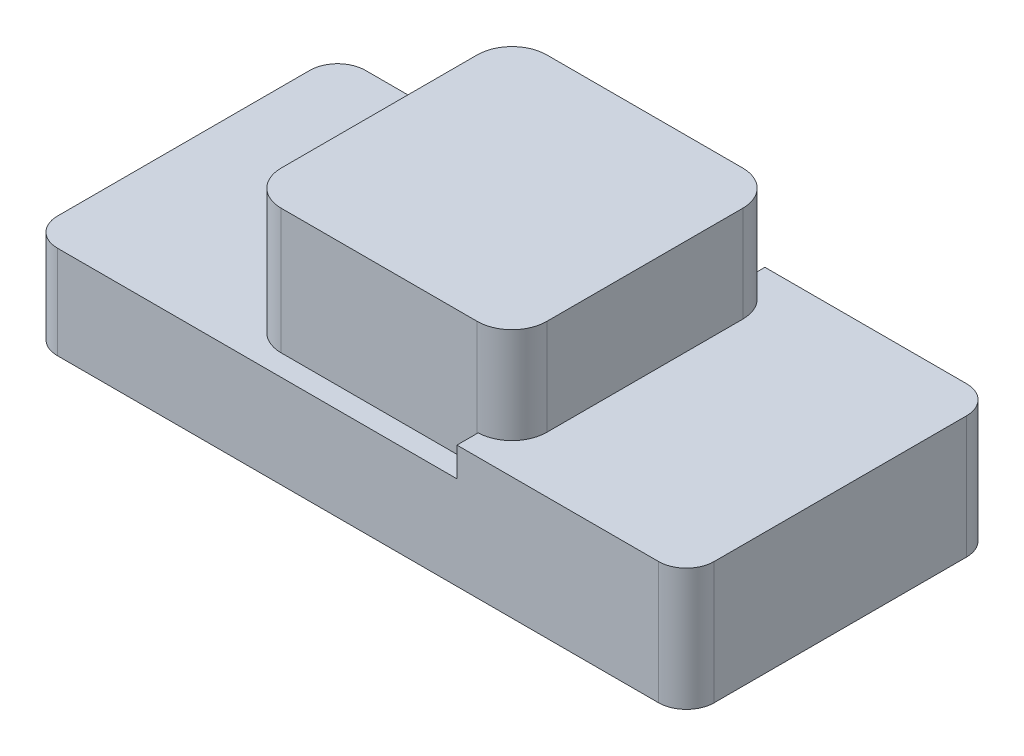
ISO-10303-21;
HEADER;
FILE_DESCRIPTION(('STEP AP214'),'2;1');
FILE_NAME('part.step','',(''),(''),'','','');
FILE_SCHEMA(('AUTOMOTIVE_DESIGN { 1 0 10303 214 1 1 1 1 }'));
ENDSEC;
DATA;
#1=APPLICATION_CONTEXT('core data for automotive mechanical design processes');
#2=APPLICATION_PROTOCOL_DEFINITION('international standard','automotive_design',2000,#1);
#3=PRODUCT_CONTEXT('',#1,'mechanical');
#4=PRODUCT('Part','Part','',(#3));
#5=PRODUCT_RELATED_PRODUCT_CATEGORY('part','',(#4));
#6=PRODUCT_DEFINITION_FORMATION('','',#4);
#7=PRODUCT_DEFINITION_CONTEXT('part definition',#1,'design');
#8=PRODUCT_DEFINITION('design','',#6,#7);
#9=PRODUCT_DEFINITION_SHAPE('','',#8);
#10=(LENGTH_UNIT() NAMED_UNIT(*) SI_UNIT(.MILLI.,.METRE.));
#11=(NAMED_UNIT(*) PLANE_ANGLE_UNIT() SI_UNIT($,.RADIAN.));
#12=(NAMED_UNIT(*) SI_UNIT($,.STERADIAN.) SOLID_ANGLE_UNIT());
#13=UNCERTAINTY_MEASURE_WITH_UNIT(LENGTH_MEASURE(1.E-05),#10,'distance_accuracy_value','');
#14=(GEOMETRIC_REPRESENTATION_CONTEXT(3) GLOBAL_UNCERTAINTY_ASSIGNED_CONTEXT((#13)) GLOBAL_UNIT_ASSIGNED_CONTEXT((#10,
#11,#12)) REPRESENTATION_CONTEXT('',''));
#15=CARTESIAN_POINT('',(0.,0.,0.));
#16=DIRECTION('',(0.,0.,1.));
#17=DIRECTION('',(1.,0.,0.));
#18=AXIS2_PLACEMENT_3D('',#15,#16,#17);
#19=CARTESIAN_POINT('',(-16.3982852416057,17.6,44.3));
#20=DIRECTION('',(0.,-1.,0.));
#21=DIRECTION('',(0.,0.,-1.));
#22=AXIS2_PLACEMENT_3D('',#19,#20,#21);
#23=PLANE('',#22);
#24=DIRECTION('',(0.,0.,-1.));
#25=VECTOR('',#24,1.);
#26=CARTESIAN_POINT('',(16.6017147583943,17.6,44.3));
#27=LINE('',#26,#25);
#28=CARTESIAN_POINT('',(16.6017147583943,17.6,40.3));
#29=VERTEX_POINT('',#28);
#30=CARTESIAN_POINT('',(16.6017147583943,17.6,4.));
#31=VERTEX_POINT('',#30);
#32=EDGE_CURVE('E200',#29,#31,#27,.T.);
#33=ORIENTED_EDGE('',*,*,#32,.T.);
#34=CARTESIAN_POINT('',(12.6017147583943,17.6,4.));
#35=DIRECTION('',(0.,-1.,0.));
#36=DIRECTION('',(0.,0.,-1.));
#37=AXIS2_PLACEMENT_3D('',#34,#35,#36);
#38=CIRCLE('',#37,4.);
#39=CARTESIAN_POINT('',(12.6017147583943,17.6,0.));
#40=VERTEX_POINT('',#39);
#41=EDGE_CURVE('E64',#31,#40,#38,.F.);
#42=ORIENTED_EDGE('',*,*,#41,.T.);
#43=DIRECTION('',(-1.,0.,0.));
#44=VECTOR('',#43,1.);
#45=CARTESIAN_POINT('',(-16.3982852416057,17.6,0.));
#46=LINE('',#45,#44);
#47=CARTESIAN_POINT('',(-16.3982852416057,17.6,0.));
#48=VERTEX_POINT('',#47);
#49=EDGE_CURVE('E214',#40,#48,#46,.T.);
#50=ORIENTED_EDGE('',*,*,#49,.T.);
#51=DIRECTION('',(0.,0.,-1.));
#52=VECTOR('',#51,1.);
#53=CARTESIAN_POINT('',(-16.3982852416057,17.6,44.3));
#54=LINE('',#53,#52);
#55=CARTESIAN_POINT('',(-16.3982852416057,17.6,3.05169028570657));
#56=VERTEX_POINT('',#55);
#57=EDGE_CURVE('E201',#56,#48,#54,.T.);
#58=ORIENTED_EDGE('',*,*,#57,.F.);
#59=CARTESIAN_POINT('',(-16.5282852416057,17.6,8.05));
#60=DIRECTION('',(0.,-1.,0.));
#61=DIRECTION('',(0.,0.,-1.));
#62=AXIS2_PLACEMENT_3D('',#59,#60,#61);
#63=CIRCLE('',#62,5.);
#64=CARTESIAN_POINT('',(-11.5282852416057,17.6,8.05));
#65=VERTEX_POINT('',#64);
#66=EDGE_CURVE('E305',#56,#65,#63,.T.);
#67=ORIENTED_EDGE('',*,*,#66,.T.);
#68=DIRECTION('',(0.,0.,-1.));
#69=VECTOR('',#68,1.);
#70=CARTESIAN_POINT('',(-11.5282852416056,17.6,44.3));
#71=LINE('',#70,#69);
#72=CARTESIAN_POINT('',(-11.5282852416056,17.6,36.25));
#73=VERTEX_POINT('',#72);
#74=EDGE_CURVE('E250',#73,#65,#71,.T.);
#75=ORIENTED_EDGE('',*,*,#74,.F.);
#76=CARTESIAN_POINT('',(-16.5282852416056,17.6,36.25));
#77=DIRECTION('',(0.,-1.,0.));
#78=DIRECTION('',(0.,0.,-1.));
#79=AXIS2_PLACEMENT_3D('',#76,#77,#78);
#80=CIRCLE('',#79,5.);
#81=CARTESIAN_POINT('',(-16.3982852416057,17.6,41.2483097142934));
#82=VERTEX_POINT('',#81);
#83=EDGE_CURVE('E195',#73,#82,#80,.T.);
#84=ORIENTED_EDGE('',*,*,#83,.T.);
#85=CARTESIAN_POINT('',(-16.3982852416057,17.6,44.3));
#86=VERTEX_POINT('',#85);
#87=EDGE_CURVE('E192',#86,#82,#54,.T.);
#88=ORIENTED_EDGE('',*,*,#87,.F.);
#89=DIRECTION('',(-1.,0.,0.));
#90=VECTOR('',#89,1.);
#91=CARTESIAN_POINT('',(-16.3982852416057,17.6,44.3));
#92=LINE('',#91,#90);
#93=CARTESIAN_POINT('',(12.6017147583943,17.6,44.3));
#94=VERTEX_POINT('',#93);
#95=EDGE_CURVE('E179',#94,#86,#92,.T.);
#96=ORIENTED_EDGE('',*,*,#95,.F.);
#97=CARTESIAN_POINT('',(12.6017147583943,17.6,40.3));
#98=DIRECTION('',(0.,-1.,0.));
#99=DIRECTION('',(0.,0.,-1.));
#100=AXIS2_PLACEMENT_3D('',#97,#98,#99);
#101=CIRCLE('',#100,4.);
#102=EDGE_CURVE('E57',#94,#29,#101,.F.);
#103=ORIENTED_EDGE('',*,*,#102,.T.);
#104=EDGE_LOOP('',(#33,#42,#50,#58,#67,#75,#84,#88,#96,#103));
#105=FACE_BOUND('',#104,.T.);
#106=ADVANCED_FACE('F41',(#105),#23,.F.);
#107=CARTESIAN_POINT('',(-16.3982852416057,13.4,44.3));
#108=DIRECTION('',(1.,0.,0.));
#109=DIRECTION('',(0.,0.,-1.));
#110=AXIS2_PLACEMENT_3D('',#107,#108,#109);
#111=PLANE('',#110);
#112=ORIENTED_EDGE('',*,*,#87,.T.);
#113=DIRECTION('',(0.,-1.,0.));
#114=VECTOR('',#113,1.);
#115=CARTESIAN_POINT('',(-16.3982852416057,17.6,41.2483097142934));
#116=LINE('',#115,#114);
#117=CARTESIAN_POINT('',(-16.3982852416057,13.4,41.2483097142934));
#118=VERTEX_POINT('',#117);
#119=EDGE_CURVE('E310',#82,#118,#116,.T.);
#120=ORIENTED_EDGE('',*,*,#119,.T.);
#121=DIRECTION('',(0.,0.,-1.));
#122=VECTOR('',#121,1.);
#123=CARTESIAN_POINT('',(-16.3982852416057,13.4,44.3));
#124=LINE('',#123,#122);
#125=CARTESIAN_POINT('',(-16.3982852416057,13.4,44.3));
#126=VERTEX_POINT('',#125);
#127=EDGE_CURVE('E204',#126,#118,#124,.T.);
#128=ORIENTED_EDGE('',*,*,#127,.F.);
#129=DIRECTION('',(0.,-1.,0.));
#130=VECTOR('',#129,1.);
#131=CARTESIAN_POINT('',(-16.3982852416057,13.4,44.3));
#132=LINE('',#131,#130);
#133=EDGE_CURVE('E185',#86,#126,#132,.T.);
#134=ORIENTED_EDGE('',*,*,#133,.F.);
#135=EDGE_LOOP('',(#112,#120,#128,#134));
#136=FACE_BOUND('',#135,.T.);
#137=ADVANCED_FACE('F203',(#136),#111,.F.);
#138=CARTESIAN_POINT('',(-16.3982852416057,13.4,3.05169028570657));
#139=VERTEX_POINT('',#138);
#140=CARTESIAN_POINT('',(-16.3982852416057,13.4,0.));
#141=VERTEX_POINT('',#140);
#142=EDGE_CURVE('E237',#139,#141,#124,.T.);
#143=ORIENTED_EDGE('',*,*,#142,.F.);
#144=DIRECTION('',(0.,-1.,0.));
#145=VECTOR('',#144,1.);
#146=CARTESIAN_POINT('',(-16.3982852416057,13.4,3.05169028570657));
#147=LINE('',#146,#145);
#148=EDGE_CURVE('E301',#139,#56,#147,.F.);
#149=ORIENTED_EDGE('',*,*,#148,.T.);
#150=ORIENTED_EDGE('',*,*,#57,.T.);
#151=DIRECTION('',(0.,-1.,0.));
#152=VECTOR('',#151,1.);
#153=CARTESIAN_POINT('',(-16.3982852416057,13.4,0.));
#154=LINE('',#153,#152);
#155=EDGE_CURVE('E217',#48,#141,#154,.T.);
#156=ORIENTED_EDGE('',*,*,#155,.T.);
#157=EDGE_LOOP('',(#143,#149,#150,#156));
#158=FACE_BOUND('',#157,.T.);
#159=ADVANCED_FACE('F438',(#158),#111,.F.);
#160=CARTESIAN_POINT('',(-16.3982852416057,13.4,44.3));
#161=DIRECTION('',(0.,-1.,0.));
#162=DIRECTION('',(0.,0.,-1.));
#163=AXIS2_PLACEMENT_3D('',#160,#161,#162);
#164=PLANE('',#163);
#165=DIRECTION('',(-1.,0.,0.));
#166=VECTOR('',#165,1.);
#167=CARTESIAN_POINT('',(-16.3982852416057,13.4,0.));
#168=LINE('',#167,#166);
#169=CARTESIAN_POINT('',(-73.8582852416056,13.4,0.));
#170=VERTEX_POINT('',#169);
#171=EDGE_CURVE('E222',#141,#170,#168,.T.);
#172=ORIENTED_EDGE('',*,*,#171,.T.);
#173=CARTESIAN_POINT('',(-73.8582852416056,13.4,4.));
#174=DIRECTION('',(0.,-1.,0.));
#175=DIRECTION('',(0.,0.,-1.));
#176=AXIS2_PLACEMENT_3D('',#173,#174,#175);
#177=CIRCLE('',#176,4.);
#178=CARTESIAN_POINT('',(-77.8582852416057,13.4,4.));
#179=VERTEX_POINT('',#178);
#180=EDGE_CURVE('E347',#170,#179,#177,.F.);
#181=ORIENTED_EDGE('',*,*,#180,.T.);
#182=DIRECTION('',(0.,0.,-1.));
#183=VECTOR('',#182,1.);
#184=CARTESIAN_POINT('',(-77.8582852416057,13.4,44.3));
#185=LINE('',#184,#183);
#186=CARTESIAN_POINT('',(-77.8582852416057,13.4,40.3));
#187=VERTEX_POINT('',#186);
#188=EDGE_CURVE('E233',#187,#179,#185,.T.);
#189=ORIENTED_EDGE('',*,*,#188,.F.);
#190=CARTESIAN_POINT('',(-73.8582852416056,13.4,40.3));
#191=DIRECTION('',(0.,-1.,0.));
#192=DIRECTION('',(0.,0.,-1.));
#193=AXIS2_PLACEMENT_3D('',#190,#191,#192);
#194=CIRCLE('',#193,4.);
#195=CARTESIAN_POINT('',(-73.8582852416056,13.4,44.3));
#196=VERTEX_POINT('',#195);
#197=EDGE_CURVE('E344',#187,#196,#194,.F.);
#198=ORIENTED_EDGE('',*,*,#197,.T.);
#199=DIRECTION('',(-1.,0.,0.));
#200=VECTOR('',#199,1.);
#201=CARTESIAN_POINT('',(-16.3982852416057,13.4,44.3));
#202=LINE('',#201,#200);
#203=EDGE_CURVE('E207',#126,#196,#202,.T.);
#204=ORIENTED_EDGE('',*,*,#203,.F.);
#205=ORIENTED_EDGE('',*,*,#127,.T.);
#206=CARTESIAN_POINT('',(-16.5282852416056,13.4,36.25));
#207=DIRECTION('',(0.,-1.,0.));
#208=DIRECTION('',(0.,0.,-1.));
#209=AXIS2_PLACEMENT_3D('',#206,#207,#208);
#210=CIRCLE('',#209,5.);
#211=CARTESIAN_POINT('',(-16.5282852416056,13.4,41.25));
#212=VERTEX_POINT('',#211);
#213=EDGE_CURVE('E313',#118,#212,#210,.T.);
#214=ORIENTED_EDGE('',*,*,#213,.T.);
#215=DIRECTION('',(1.,0.,0.));
#216=VECTOR('',#215,1.);
#217=CARTESIAN_POINT('',(-49.7282852416057,13.4,41.25));
#218=LINE('',#217,#216);
#219=CARTESIAN_POINT('',(-44.7282852416057,13.4,41.25));
#220=VERTEX_POINT('',#219);
#221=EDGE_CURVE('E372',#220,#212,#218,.T.);
#222=ORIENTED_EDGE('',*,*,#221,.F.);
#223=CARTESIAN_POINT('',(-44.7282852416057,13.4,36.25));
#224=DIRECTION('',(0.,-1.,0.));
#225=DIRECTION('',(0.,0.,-1.));
#226=AXIS2_PLACEMENT_3D('',#223,#224,#225);
#227=CIRCLE('',#226,5.);
#228=CARTESIAN_POINT('',(-49.7282852416057,13.4,36.25));
#229=VERTEX_POINT('',#228);
#230=EDGE_CURVE('E316',#220,#229,#227,.T.);
#231=ORIENTED_EDGE('',*,*,#230,.T.);
#232=DIRECTION('',(0.,0.,1.));
#233=VECTOR('',#232,1.);
#234=CARTESIAN_POINT('',(-49.7282852416057,13.4,41.25));
#235=LINE('',#234,#233);
#236=CARTESIAN_POINT('',(-49.7282852416057,13.4,8.05));
#237=VERTEX_POINT('',#236);
#238=EDGE_CURVE('E377',#237,#229,#235,.T.);
#239=ORIENTED_EDGE('',*,*,#238,.F.);
#240=CARTESIAN_POINT('',(-44.7282852416057,13.4,8.05));
#241=DIRECTION('',(0.,-1.,0.));
#242=DIRECTION('',(0.,0.,-1.));
#243=AXIS2_PLACEMENT_3D('',#240,#241,#242);
#244=CIRCLE('',#243,5.);
#245=CARTESIAN_POINT('',(-44.7282852416057,13.4,3.05));
#246=VERTEX_POINT('',#245);
#247=EDGE_CURVE('E294',#237,#246,#244,.T.);
#248=ORIENTED_EDGE('',*,*,#247,.T.);
#249=DIRECTION('',(-1.,0.,0.));
#250=VECTOR('',#249,1.);
#251=CARTESIAN_POINT('',(-16.3982852416057,13.4,3.05));
#252=LINE('',#251,#250);
#253=CARTESIAN_POINT('',(-16.5282852416057,13.4,3.05));
#254=VERTEX_POINT('',#253);
#255=EDGE_CURVE('E246',#254,#246,#252,.T.);
#256=ORIENTED_EDGE('',*,*,#255,.F.);
#257=CARTESIAN_POINT('',(-16.5282852416057,13.4,8.05));
#258=DIRECTION('',(0.,-1.,0.));
#259=DIRECTION('',(0.,0.,-1.));
#260=AXIS2_PLACEMENT_3D('',#257,#258,#259);
#261=CIRCLE('',#260,5.);
#262=EDGE_CURVE('E297',#254,#139,#261,.T.);
#263=ORIENTED_EDGE('',*,*,#262,.T.);
#264=ORIENTED_EDGE('',*,*,#142,.T.);
#265=EDGE_LOOP('',(#172,#181,#189,#198,#204,#205,#214,#222,#231,#239,#248,#256,#263,#264));
#266=FACE_BOUND('',#265,.T.);
#267=ADVANCED_FACE('F411',(#266),#164,.F.);
#268=CARTESIAN_POINT('',(16.6017147583943,0.,44.3));
#269=DIRECTION('',(-1.,0.,0.));
#270=DIRECTION('',(0.,0.,1.));
#271=AXIS2_PLACEMENT_3D('',#268,#269,#270);
#272=PLANE('',#271);
#273=DIRECTION('',(0.,0.,-1.));
#274=VECTOR('',#273,1.);
#275=CARTESIAN_POINT('',(16.6017147583943,0.,44.3));
#276=LINE('',#275,#274);
#277=CARTESIAN_POINT('',(16.6017147583943,0.,40.3));
#278=VERTEX_POINT('',#277);
#279=CARTESIAN_POINT('',(16.6017147583943,0.,4.));
#280=VERTEX_POINT('',#279);
#281=EDGE_CURVE('E242',#278,#280,#276,.T.);
#282=ORIENTED_EDGE('',*,*,#281,.T.);
#283=DIRECTION('',(0.,1.,0.));
#284=VECTOR('',#283,1.);
#285=CARTESIAN_POINT('',(16.6017147583943,0.,4.));
#286=LINE('',#285,#284);
#287=EDGE_CURVE('E353',#280,#31,#286,.T.);
#288=ORIENTED_EDGE('',*,*,#287,.T.);
#289=ORIENTED_EDGE('',*,*,#32,.F.);
#290=DIRECTION('',(0.,1.,0.));
#291=VECTOR('',#290,1.);
#292=CARTESIAN_POINT('',(16.6017147583943,0.,40.3));
#293=LINE('',#292,#291);
#294=EDGE_CURVE('E350',#29,#278,#293,.F.);
#295=ORIENTED_EDGE('',*,*,#294,.T.);
#296=EDGE_LOOP('',(#282,#288,#289,#295));
#297=FACE_BOUND('',#296,.T.);
#298=ADVANCED_FACE('F459',(#297),#272,.F.);
#299=CARTESIAN_POINT('',(-77.8582852416057,0.,44.3));
#300=DIRECTION('',(1.,0.,0.));
#301=DIRECTION('',(0.,0.,-1.));
#302=AXIS2_PLACEMENT_3D('',#299,#300,#301);
#303=PLANE('',#302);
#304=ORIENTED_EDGE('',*,*,#188,.T.);
#305=DIRECTION('',(0.,-1.,0.));
#306=VECTOR('',#305,1.);
#307=CARTESIAN_POINT('',(-77.8582852416057,0.,4.));
#308=LINE('',#307,#306);
#309=CARTESIAN_POINT('',(-77.8582852416057,0.,4.));
#310=VERTEX_POINT('',#309);
#311=EDGE_CURVE('E322',#179,#310,#308,.T.);
#312=ORIENTED_EDGE('',*,*,#311,.T.);
#313=DIRECTION('',(0.,0.,-1.));
#314=VECTOR('',#313,1.);
#315=CARTESIAN_POINT('',(-77.8582852416057,0.,44.3));
#316=LINE('',#315,#314);
#317=CARTESIAN_POINT('',(-77.8582852416057,0.,40.3));
#318=VERTEX_POINT('',#317);
#319=EDGE_CURVE('E210',#318,#310,#316,.T.);
#320=ORIENTED_EDGE('',*,*,#319,.F.);
#321=DIRECTION('',(0.,-1.,0.));
#322=VECTOR('',#321,1.);
#323=CARTESIAN_POINT('',(-77.8582852416057,13.4,40.3));
#324=LINE('',#323,#322);
#325=EDGE_CURVE('E319',#318,#187,#324,.F.);
#326=ORIENTED_EDGE('',*,*,#325,.T.);
#327=EDGE_LOOP('',(#304,#312,#320,#326));
#328=FACE_BOUND('',#327,.T.);
#329=ADVANCED_FACE('F454',(#328),#303,.F.);
#330=CARTESIAN_POINT('',(0.,0.,44.3));
#331=DIRECTION('',(0.,1.,0.));
#332=DIRECTION('',(0.,0.,1.));
#333=AXIS2_PLACEMENT_3D('',#330,#331,#332);
#334=PLANE('',#333);
#335=ORIENTED_EDGE('',*,*,#319,.T.);
#336=CARTESIAN_POINT('',(-73.8582852416056,0.,4.));
#337=DIRECTION('',(0.,1.,0.));
#338=DIRECTION('',(0.,0.,1.));
#339=AXIS2_PLACEMENT_3D('',#336,#337,#338);
#340=CIRCLE('',#339,4.);
#341=CARTESIAN_POINT('',(-73.8582852416056,0.,0.));
#342=VERTEX_POINT('',#341);
#343=EDGE_CURVE('E335',#310,#342,#340,.F.);
#344=ORIENTED_EDGE('',*,*,#343,.T.);
#345=DIRECTION('',(1.,0.,0.));
#346=VECTOR('',#345,1.);
#347=CARTESIAN_POINT('',(0.,0.,0.));
#348=LINE('',#347,#346);
#349=CARTESIAN_POINT('',(12.6017147583943,0.,0.));
#350=VERTEX_POINT('',#349);
#351=EDGE_CURVE('E226',#342,#350,#348,.T.);
#352=ORIENTED_EDGE('',*,*,#351,.T.);
#353=CARTESIAN_POINT('',(12.6017147583943,0.,4.));
#354=DIRECTION('',(0.,1.,0.));
#355=DIRECTION('',(0.,0.,1.));
#356=AXIS2_PLACEMENT_3D('',#353,#354,#355);
#357=CIRCLE('',#356,4.);
#358=EDGE_CURVE('E332',#350,#280,#357,.F.);
#359=ORIENTED_EDGE('',*,*,#358,.T.);
#360=ORIENTED_EDGE('',*,*,#281,.F.);
#361=CARTESIAN_POINT('',(12.6017147583943,0.,40.3));
#362=DIRECTION('',(0.,1.,0.));
#363=DIRECTION('',(0.,0.,1.));
#364=AXIS2_PLACEMENT_3D('',#361,#362,#363);
#365=CIRCLE('',#364,4.);
#366=CARTESIAN_POINT('',(12.6017147583943,0.,44.3));
#367=VERTEX_POINT('',#366);
#368=EDGE_CURVE('E329',#278,#367,#365,.F.);
#369=ORIENTED_EDGE('',*,*,#368,.T.);
#370=DIRECTION('',(1.,0.,0.));
#371=VECTOR('',#370,1.);
#372=CARTESIAN_POINT('',(0.,0.,44.3));
#373=LINE('',#372,#371);
#374=CARTESIAN_POINT('',(-73.8582852416056,0.,44.3));
#375=VERTEX_POINT('',#374);
#376=EDGE_CURVE('E189',#375,#367,#373,.T.);
#377=ORIENTED_EDGE('',*,*,#376,.F.);
#378=CARTESIAN_POINT('',(-73.8582852416056,0.,40.3));
#379=DIRECTION('',(0.,1.,0.));
#380=DIRECTION('',(0.,0.,1.));
#381=AXIS2_PLACEMENT_3D('',#378,#379,#380);
#382=CIRCLE('',#381,4.);
#383=EDGE_CURVE('E326',#375,#318,#382,.F.);
#384=ORIENTED_EDGE('',*,*,#383,.T.);
#385=EDGE_LOOP('',(#335,#344,#352,#359,#360,#369,#377,#384));
#386=FACE_BOUND('',#385,.T.);
#387=ADVANCED_FACE('F366',(#386),#334,.F.);
#388=CARTESIAN_POINT('',(0.,0.,44.3));
#389=DIRECTION('',(0.,0.,1.));
#390=DIRECTION('',(1.,0.,0.));
#391=AXIS2_PLACEMENT_3D('',#388,#389,#390);
#392=PLANE('',#391);
#393=ORIENTED_EDGE('',*,*,#376,.T.);
#394=DIRECTION('',(0.,1.,0.));
#395=VECTOR('',#394,1.);
#396=CARTESIAN_POINT('',(12.6017147583943,17.6,44.3));
#397=LINE('',#396,#395);
#398=EDGE_CURVE('E11',#367,#94,#397,.T.);
#399=ORIENTED_EDGE('',*,*,#398,.T.);
#400=ORIENTED_EDGE('',*,*,#95,.T.);
#401=ORIENTED_EDGE('',*,*,#133,.T.);
#402=ORIENTED_EDGE('',*,*,#203,.T.);
#403=DIRECTION('',(0.,-1.,0.));
#404=VECTOR('',#403,1.);
#405=CARTESIAN_POINT('',(-73.8582852416056,0.,44.3));
#406=LINE('',#405,#404);
#407=EDGE_CURVE('E50',#196,#375,#406,.T.);
#408=ORIENTED_EDGE('',*,*,#407,.T.);
#409=EDGE_LOOP('',(#393,#399,#400,#401,#402,#408));
#410=FACE_BOUND('',#409,.T.);
#411=ADVANCED_FACE('F182',(#410),#392,.T.);
#412=CARTESIAN_POINT('',(0.,0.,0.));
#413=DIRECTION('',(0.,0.,1.));
#414=DIRECTION('',(1.,0.,0.));
#415=AXIS2_PLACEMENT_3D('',#412,#413,#414);
#416=PLANE('',#415);
#417=ORIENTED_EDGE('',*,*,#351,.F.);
#418=DIRECTION('',(0.,-1.,0.));
#419=VECTOR('',#418,1.);
#420=CARTESIAN_POINT('',(-73.8582852416056,0.,0.));
#421=LINE('',#420,#419);
#422=EDGE_CURVE('E341',#342,#170,#421,.F.);
#423=ORIENTED_EDGE('',*,*,#422,.T.);
#424=ORIENTED_EDGE('',*,*,#171,.F.);
#425=ORIENTED_EDGE('',*,*,#155,.F.);
#426=ORIENTED_EDGE('',*,*,#49,.F.);
#427=DIRECTION('',(0.,1.,0.));
#428=VECTOR('',#427,1.);
#429=CARTESIAN_POINT('',(12.6017147583943,0.,0.));
#430=LINE('',#429,#428);
#431=EDGE_CURVE('E338',#40,#350,#430,.F.);
#432=ORIENTED_EDGE('',*,*,#431,.T.);
#433=EDGE_LOOP('',(#417,#423,#424,#425,#426,#432));
#434=FACE_BOUND('',#433,.T.);
#435=ADVANCED_FACE('F446',(#434),#416,.F.);
#436=CARTESIAN_POINT('',(-11.5282852416056,31.42,41.25));
#437=DIRECTION('',(-1.,0.,0.));
#438=DIRECTION('',(0.,0.,1.));
#439=AXIS2_PLACEMENT_3D('',#436,#437,#438);
#440=PLANE('',#439);
#441=ORIENTED_EDGE('',*,*,#74,.T.);
#442=DIRECTION('',(0.,-1.,0.));
#443=VECTOR('',#442,1.);
#444=CARTESIAN_POINT('',(-11.5282852416057,31.42,8.05));
#445=LINE('',#444,#443);
#446=CARTESIAN_POINT('',(-11.5282852416057,31.42,8.05));
#447=VERTEX_POINT('',#446);
#448=EDGE_CURVE('E284',#65,#447,#445,.F.);
#449=ORIENTED_EDGE('',*,*,#448,.T.);
#450=DIRECTION('',(0.,0.,-1.));
#451=VECTOR('',#450,1.);
#452=CARTESIAN_POINT('',(-11.5282852416056,31.42,41.25));
#453=LINE('',#452,#451);
#454=CARTESIAN_POINT('',(-11.5282852416056,31.42,36.25));
#455=VERTEX_POINT('',#454);
#456=EDGE_CURVE('E384',#455,#447,#453,.T.);
#457=ORIENTED_EDGE('',*,*,#456,.F.);
#458=DIRECTION('',(0.,-1.,0.));
#459=VECTOR('',#458,1.);
#460=CARTESIAN_POINT('',(-11.5282852416056,31.42,36.25));
#461=LINE('',#460,#459);
#462=EDGE_CURVE('E280',#455,#73,#461,.T.);
#463=ORIENTED_EDGE('',*,*,#462,.T.);
#464=EDGE_LOOP('',(#441,#449,#457,#463));
#465=FACE_BOUND('',#464,.T.);
#466=ADVANCED_FACE('F421',(#465),#440,.F.);
#467=CARTESIAN_POINT('',(-49.7282852416057,31.42,41.25));
#468=DIRECTION('',(0.,0.,-1.));
#469=DIRECTION('',(-1.,0.,0.));
#470=AXIS2_PLACEMENT_3D('',#467,#468,#469);
#471=PLANE('',#470);
#472=ORIENTED_EDGE('',*,*,#221,.T.);
#473=DIRECTION('',(0.,-1.,0.));
#474=VECTOR('',#473,1.);
#475=CARTESIAN_POINT('',(-16.5282852416056,31.42,41.25));
#476=LINE('',#475,#474);
#477=CARTESIAN_POINT('',(-16.5282852416056,31.42,41.25));
#478=VERTEX_POINT('',#477);
#479=EDGE_CURVE('E291',#212,#478,#476,.F.);
#480=ORIENTED_EDGE('',*,*,#479,.T.);
#481=DIRECTION('',(1.,0.,0.));
#482=VECTOR('',#481,1.);
#483=CARTESIAN_POINT('',(-49.7282852416057,31.42,41.25));
#484=LINE('',#483,#482);
#485=CARTESIAN_POINT('',(-44.7282852416057,31.42,41.25));
#486=VERTEX_POINT('',#485);
#487=EDGE_CURVE('E388',#486,#478,#484,.T.);
#488=ORIENTED_EDGE('',*,*,#487,.F.);
#489=DIRECTION('',(0.,-1.,0.));
#490=VECTOR('',#489,1.);
#491=CARTESIAN_POINT('',(-44.7282852416057,31.42,41.25));
#492=LINE('',#491,#490);
#493=EDGE_CURVE('E287',#486,#220,#492,.T.);
#494=ORIENTED_EDGE('',*,*,#493,.T.);
#495=EDGE_LOOP('',(#472,#480,#488,#494));
#496=FACE_BOUND('',#495,.T.);
#497=ADVANCED_FACE('F408',(#496),#471,.F.);
#498=CARTESIAN_POINT('',(-49.7282852416057,31.42,3.05));
#499=DIRECTION('',(0.,0.,1.));
#500=DIRECTION('',(1.,0.,0.));
#501=AXIS2_PLACEMENT_3D('',#498,#499,#500);
#502=PLANE('',#501);
#503=ORIENTED_EDGE('',*,*,#255,.T.);
#504=DIRECTION('',(0.,-1.,0.));
#505=VECTOR('',#504,1.);
#506=CARTESIAN_POINT('',(-44.7282852416057,31.42,3.05));
#507=LINE('',#506,#505);
#508=CARTESIAN_POINT('',(-44.7282852416057,31.42,3.05));
#509=VERTEX_POINT('',#508);
#510=EDGE_CURVE('E265',#246,#509,#507,.F.);
#511=ORIENTED_EDGE('',*,*,#510,.T.);
#512=DIRECTION('',(-1.,0.,0.));
#513=VECTOR('',#512,1.);
#514=CARTESIAN_POINT('',(-49.7282852416057,31.42,3.05));
#515=LINE('',#514,#513);
#516=CARTESIAN_POINT('',(-16.5282852416057,31.42,3.05));
#517=VERTEX_POINT('',#516);
#518=EDGE_CURVE('E218',#517,#509,#515,.T.);
#519=ORIENTED_EDGE('',*,*,#518,.F.);
#520=DIRECTION('',(0.,-1.,0.));
#521=VECTOR('',#520,1.);
#522=CARTESIAN_POINT('',(-16.5282852416057,31.42,3.05));
#523=LINE('',#522,#521);
#524=EDGE_CURVE('E261',#517,#254,#523,.T.);
#525=ORIENTED_EDGE('',*,*,#524,.T.);
#526=EDGE_LOOP('',(#503,#511,#519,#525));
#527=FACE_BOUND('',#526,.T.);
#528=ADVANCED_FACE('F430',(#527),#502,.F.);
#529=CARTESIAN_POINT('',(-49.7282852416057,31.42,41.25));
#530=DIRECTION('',(1.,0.,0.));
#531=DIRECTION('',(0.,0.,-1.));
#532=AXIS2_PLACEMENT_3D('',#529,#530,#531);
#533=PLANE('',#532);
#534=DIRECTION('',(0.,0.,1.));
#535=VECTOR('',#534,1.);
#536=CARTESIAN_POINT('',(-49.7282852416057,31.42,41.25));
#537=LINE('',#536,#535);
#538=CARTESIAN_POINT('',(-49.7282852416057,31.42,8.05));
#539=VERTEX_POINT('',#538);
#540=CARTESIAN_POINT('',(-49.7282852416057,31.42,36.25));
#541=VERTEX_POINT('',#540);
#542=EDGE_CURVE('E376',#539,#541,#537,.T.);
#543=ORIENTED_EDGE('',*,*,#542,.F.);
#544=DIRECTION('',(0.,-1.,0.));
#545=VECTOR('',#544,1.);
#546=CARTESIAN_POINT('',(-49.7282852416057,31.42,8.05));
#547=LINE('',#546,#545);
#548=EDGE_CURVE('E257',#539,#237,#547,.T.);
#549=ORIENTED_EDGE('',*,*,#548,.T.);
#550=ORIENTED_EDGE('',*,*,#238,.T.);
#551=DIRECTION('',(0.,-1.,0.));
#552=VECTOR('',#551,1.);
#553=CARTESIAN_POINT('',(-49.7282852416057,31.42,36.25));
#554=LINE('',#553,#552);
#555=EDGE_CURVE('E254',#229,#541,#554,.F.);
#556=ORIENTED_EDGE('',*,*,#555,.T.);
#557=EDGE_LOOP('',(#543,#549,#550,#556));
#558=FACE_BOUND('',#557,.T.);
#559=ADVANCED_FACE('F435',(#558),#533,.F.);
#560=CARTESIAN_POINT('',(0.,31.42,0.));
#561=DIRECTION('',(0.,-1.,0.));
#562=DIRECTION('',(0.,0.,-1.));
#563=AXIS2_PLACEMENT_3D('',#560,#561,#562);
#564=PLANE('',#563);
#565=ORIENTED_EDGE('',*,*,#518,.T.);
#566=CARTESIAN_POINT('',(-44.7282852416057,31.42,8.05));
#567=DIRECTION('',(0.,-1.,0.));
#568=DIRECTION('',(0.,0.,-1.));
#569=AXIS2_PLACEMENT_3D('',#566,#567,#568);
#570=CIRCLE('',#569,5.);
#571=EDGE_CURVE('E277',#509,#539,#570,.F.);
#572=ORIENTED_EDGE('',*,*,#571,.T.);
#573=ORIENTED_EDGE('',*,*,#542,.T.);
#574=CARTESIAN_POINT('',(-44.7282852416057,31.42,36.25));
#575=DIRECTION('',(0.,-1.,0.));
#576=DIRECTION('',(0.,0.,-1.));
#577=AXIS2_PLACEMENT_3D('',#574,#575,#576);
#578=CIRCLE('',#577,5.);
#579=EDGE_CURVE('E268',#541,#486,#578,.F.);
#580=ORIENTED_EDGE('',*,*,#579,.T.);
#581=ORIENTED_EDGE('',*,*,#487,.T.);
#582=CARTESIAN_POINT('',(-16.5282852416056,31.42,36.25));
#583=DIRECTION('',(0.,-1.,0.));
#584=DIRECTION('',(0.,0.,-1.));
#585=AXIS2_PLACEMENT_3D('',#582,#583,#584);
#586=CIRCLE('',#585,5.);
#587=EDGE_CURVE('E271',#478,#455,#586,.F.);
#588=ORIENTED_EDGE('',*,*,#587,.T.);
#589=ORIENTED_EDGE('',*,*,#456,.T.);
#590=CARTESIAN_POINT('',(-16.5282852416057,31.42,8.05));
#591=DIRECTION('',(0.,-1.,0.));
#592=DIRECTION('',(0.,0.,-1.));
#593=AXIS2_PLACEMENT_3D('',#590,#591,#592);
#594=CIRCLE('',#593,5.);
#595=EDGE_CURVE('E274',#447,#517,#594,.F.);
#596=ORIENTED_EDGE('',*,*,#595,.T.);
#597=EDGE_LOOP('',(#565,#572,#573,#580,#581,#588,#589,#596));
#598=FACE_BOUND('',#597,.T.);
#599=ADVANCED_FACE('F397',(#598),#564,.F.);
#600=CARTESIAN_POINT('',(-44.7282852416057,31.42,8.05));
#601=DIRECTION('',(0.,-1.,0.));
#602=DIRECTION('',(0.,0.,-1.));
#603=AXIS2_PLACEMENT_3D('',#600,#601,#602);
#604=CYLINDRICAL_SURFACE('',#603,5.);
#605=ORIENTED_EDGE('',*,*,#571,.F.);
#606=ORIENTED_EDGE('',*,*,#510,.F.);
#607=ORIENTED_EDGE('',*,*,#247,.F.);
#608=ORIENTED_EDGE('',*,*,#548,.F.);
#609=EDGE_LOOP('',(#605,#606,#607,#608));
#610=FACE_BOUND('',#609,.T.);
#611=ADVANCED_FACE('F434',(#610),#604,.T.);
#612=CARTESIAN_POINT('',(-16.5282852416057,31.42,8.05));
#613=DIRECTION('',(0.,-1.,0.));
#614=DIRECTION('',(0.,0.,-1.));
#615=AXIS2_PLACEMENT_3D('',#612,#613,#614);
#616=CYLINDRICAL_SURFACE('',#615,5.);
#617=ORIENTED_EDGE('',*,*,#595,.F.);
#618=ORIENTED_EDGE('',*,*,#448,.F.);
#619=ORIENTED_EDGE('',*,*,#66,.F.);
#620=ORIENTED_EDGE('',*,*,#148,.F.);
#621=ORIENTED_EDGE('',*,*,#262,.F.);
#622=ORIENTED_EDGE('',*,*,#524,.F.);
#623=EDGE_LOOP('',(#617,#618,#619,#620,#621,#622));
#624=FACE_BOUND('',#623,.T.);
#625=ADVANCED_FACE('F425',(#624),#616,.T.);
#626=CARTESIAN_POINT('',(-16.5282852416056,31.42,36.25));
#627=DIRECTION('',(0.,-1.,0.));
#628=DIRECTION('',(0.,0.,-1.));
#629=AXIS2_PLACEMENT_3D('',#626,#627,#628);
#630=CYLINDRICAL_SURFACE('',#629,5.);
#631=ORIENTED_EDGE('',*,*,#587,.F.);
#632=ORIENTED_EDGE('',*,*,#479,.F.);
#633=ORIENTED_EDGE('',*,*,#213,.F.);
#634=ORIENTED_EDGE('',*,*,#119,.F.);
#635=ORIENTED_EDGE('',*,*,#83,.F.);
#636=ORIENTED_EDGE('',*,*,#462,.F.);
#637=EDGE_LOOP('',(#631,#632,#633,#634,#635,#636));
#638=FACE_BOUND('',#637,.T.);
#639=ADVANCED_FACE('F416',(#638),#630,.T.);
#640=CARTESIAN_POINT('',(-44.7282852416057,31.42,36.25));
#641=DIRECTION('',(0.,-1.,0.));
#642=DIRECTION('',(0.,0.,-1.));
#643=AXIS2_PLACEMENT_3D('',#640,#641,#642);
#644=CYLINDRICAL_SURFACE('',#643,5.);
#645=ORIENTED_EDGE('',*,*,#579,.F.);
#646=ORIENTED_EDGE('',*,*,#555,.F.);
#647=ORIENTED_EDGE('',*,*,#230,.F.);
#648=ORIENTED_EDGE('',*,*,#493,.F.);
#649=EDGE_LOOP('',(#645,#646,#647,#648));
#650=FACE_BOUND('',#649,.T.);
#651=ADVANCED_FACE('F405',(#650),#644,.T.);
#652=CARTESIAN_POINT('',(-73.8582852416056,0.,4.));
#653=DIRECTION('',(0.,-1.,0.));
#654=DIRECTION('',(0.,0.,-1.));
#655=AXIS2_PLACEMENT_3D('',#652,#653,#654);
#656=CYLINDRICAL_SURFACE('',#655,4.);
#657=ORIENTED_EDGE('',*,*,#180,.F.);
#658=ORIENTED_EDGE('',*,*,#422,.F.);
#659=ORIENTED_EDGE('',*,*,#343,.F.);
#660=ORIENTED_EDGE('',*,*,#311,.F.);
#661=EDGE_LOOP('',(#657,#658,#659,#660));
#662=FACE_BOUND('',#661,.T.);
#663=ADVANCED_FACE('F452',(#662),#656,.T.);
#664=CARTESIAN_POINT('',(12.6017147583943,0.,4.));
#665=DIRECTION('',(0.,1.,0.));
#666=DIRECTION('',(0.,0.,1.));
#667=AXIS2_PLACEMENT_3D('',#664,#665,#666);
#668=CYLINDRICAL_SURFACE('',#667,4.);
#669=ORIENTED_EDGE('',*,*,#358,.F.);
#670=ORIENTED_EDGE('',*,*,#431,.F.);
#671=ORIENTED_EDGE('',*,*,#41,.F.);
#672=ORIENTED_EDGE('',*,*,#287,.F.);
#673=EDGE_LOOP('',(#669,#670,#671,#672));
#674=FACE_BOUND('',#673,.T.);
#675=ADVANCED_FACE('F457',(#674),#668,.T.);
#676=CARTESIAN_POINT('',(12.6017147583943,0.,40.3));
#677=DIRECTION('',(0.,-1.,0.));
#678=DIRECTION('',(0.,0.,-1.));
#679=AXIS2_PLACEMENT_3D('',#676,#677,#678);
#680=CYLINDRICAL_SURFACE('',#679,4.);
#681=ORIENTED_EDGE('',*,*,#368,.F.);
#682=ORIENTED_EDGE('',*,*,#294,.F.);
#683=ORIENTED_EDGE('',*,*,#102,.F.);
#684=ORIENTED_EDGE('',*,*,#398,.F.);
#685=EDGE_LOOP('',(#681,#682,#683,#684));
#686=FACE_BOUND('',#685,.T.);
#687=ADVANCED_FACE('F461',(#686),#680,.T.);
#688=CARTESIAN_POINT('',(-73.8582852416056,0.,40.3));
#689=DIRECTION('',(0.,1.,0.));
#690=DIRECTION('',(0.,0.,1.));
#691=AXIS2_PLACEMENT_3D('',#688,#689,#690);
#692=CYLINDRICAL_SURFACE('',#691,4.);
#693=ORIENTED_EDGE('',*,*,#197,.F.);
#694=ORIENTED_EDGE('',*,*,#325,.F.);
#695=ORIENTED_EDGE('',*,*,#383,.F.);
#696=ORIENTED_EDGE('',*,*,#407,.F.);
#697=EDGE_LOOP('',(#693,#694,#695,#696));
#698=FACE_BOUND('',#697,.T.);
#699=ADVANCED_FACE('F43',(#698),#692,.T.);
#700=CLOSED_SHELL('',(#106,#137,#159,#267,#298,#329,#387,#411,#435,#466,#497,#528,#559,#599,
#611,#625,#639,#651,#663,#675,#687,#699));
#701=MANIFOLD_SOLID_BREP('B2',#700);
#702=ADVANCED_BREP_SHAPE_REPRESENTATION('',(#18,#701),#14);
#703=SHAPE_DEFINITION_REPRESENTATION(#9,#702);
ENDSEC;
END-ISO-10303-21;
